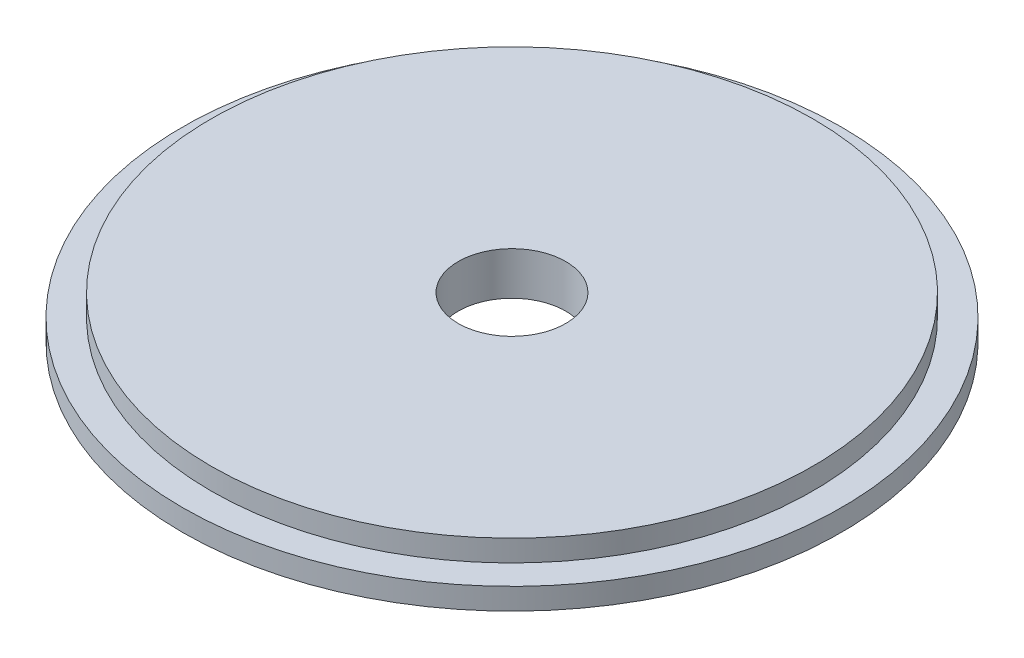
ISO-10303-21;
HEADER;
FILE_DESCRIPTION(('STEP AP214'),'2;1');
FILE_NAME('part.step','',(''),(''),'','','');
FILE_SCHEMA(('AUTOMOTIVE_DESIGN { 1 0 10303 214 1 1 1 1 }'));
ENDSEC;
DATA;
#1=APPLICATION_CONTEXT('core data for automotive mechanical design processes');
#2=APPLICATION_PROTOCOL_DEFINITION('international standard','automotive_design',2000,#1);
#3=PRODUCT_CONTEXT('',#1,'mechanical');
#4=PRODUCT('Part','Part','',(#3));
#5=PRODUCT_RELATED_PRODUCT_CATEGORY('part','',(#4));
#6=PRODUCT_DEFINITION_FORMATION('','',#4);
#7=PRODUCT_DEFINITION_CONTEXT('part definition',#1,'design');
#8=PRODUCT_DEFINITION('design','',#6,#7);
#9=PRODUCT_DEFINITION_SHAPE('','',#8);
#10=(LENGTH_UNIT() NAMED_UNIT(*) SI_UNIT(.MILLI.,.METRE.));
#11=(NAMED_UNIT(*) PLANE_ANGLE_UNIT() SI_UNIT($,.RADIAN.));
#12=(NAMED_UNIT(*) SI_UNIT($,.STERADIAN.) SOLID_ANGLE_UNIT());
#13=UNCERTAINTY_MEASURE_WITH_UNIT(LENGTH_MEASURE(1.E-05),#10,'distance_accuracy_value','');
#14=(GEOMETRIC_REPRESENTATION_CONTEXT(3) GLOBAL_UNCERTAINTY_ASSIGNED_CONTEXT((#13)) GLOBAL_UNIT_ASSIGNED_CONTEXT((#10,
#11,#12)) REPRESENTATION_CONTEXT('',''));
#15=CARTESIAN_POINT('',(0.,0.,0.));
#16=DIRECTION('',(0.,0.,1.));
#17=DIRECTION('',(1.,0.,0.));
#18=AXIS2_PLACEMENT_3D('',#15,#16,#17);
#19=CARTESIAN_POINT('',(0.,1.5,0.));
#20=DIRECTION('',(0.,-1.,0.));
#21=DIRECTION('',(0.,0.,-1.));
#22=AXIS2_PLACEMENT_3D('',#19,#20,#21);
#23=CYLINDRICAL_SURFACE('',#22,23.);
#24=CARTESIAN_POINT('',(0.,1.5,0.));
#25=DIRECTION('',(0.,1.,0.));
#26=DIRECTION('',(0.,0.,1.));
#27=AXIS2_PLACEMENT_3D('',#24,#25,#26);
#28=CIRCLE('',#27,23.);
#29=CARTESIAN_POINT('',(0.,1.5,23.));
#30=VERTEX_POINT('',#29);
#31=EDGE_CURVE('E10',#30,#30,#28,.T.);
#32=ORIENTED_EDGE('',*,*,#31,.F.);
#33=EDGE_LOOP('',(#32));
#34=FACE_BOUND('',#33,.T.);
#35=CARTESIAN_POINT('',(0.,0.,0.));
#36=DIRECTION('',(0.,1.,0.));
#37=DIRECTION('',(0.,0.,1.));
#38=AXIS2_PLACEMENT_3D('',#35,#36,#37);
#39=CIRCLE('',#38,23.);
#40=CARTESIAN_POINT('',(0.,0.,23.));
#41=VERTEX_POINT('',#40);
#42=EDGE_CURVE('E34',#41,#41,#39,.T.);
#43=ORIENTED_EDGE('',*,*,#42,.T.);
#44=EDGE_LOOP('',(#43));
#45=FACE_BOUND('',#44,.T.);
#46=ADVANCED_FACE('F31',(#34,#45),#23,.T.);
#47=CARTESIAN_POINT('',(0.,1.5,0.));
#48=DIRECTION('',(0.,1.,0.));
#49=DIRECTION('',(0.,0.,1.));
#50=AXIS2_PLACEMENT_3D('',#47,#48,#49);
#51=PLANE('',#50);
#52=CARTESIAN_POINT('',(0.,1.5,0.));
#53=DIRECTION('',(0.,1.,0.));
#54=DIRECTION('',(0.,0.,1.));
#55=AXIS2_PLACEMENT_3D('',#52,#53,#54);
#56=CIRCLE('',#55,21.);
#57=CARTESIAN_POINT('',(0.,1.5,21.));
#58=VERTEX_POINT('',#57);
#59=EDGE_CURVE('E43',#58,#58,#56,.T.);
#60=ORIENTED_EDGE('',*,*,#59,.F.);
#61=EDGE_LOOP('',(#60));
#62=FACE_BOUND('',#61,.T.);
#63=ORIENTED_EDGE('',*,*,#31,.T.);
#64=EDGE_LOOP('',(#63));
#65=FACE_BOUND('',#64,.T.);
#66=ADVANCED_FACE('F76',(#62,#65),#51,.T.);
#67=CARTESIAN_POINT('',(0.,0.,0.));
#68=DIRECTION('',(0.,1.,0.));
#69=DIRECTION('',(0.,0.,1.));
#70=AXIS2_PLACEMENT_3D('',#67,#68,#69);
#71=PLANE('',#70);
#72=CARTESIAN_POINT('',(0.,0.,0.));
#73=DIRECTION('',(0.,1.,0.));
#74=DIRECTION('',(0.,0.,1.));
#75=AXIS2_PLACEMENT_3D('',#72,#73,#74);
#76=CIRCLE('',#75,3.75);
#77=CARTESIAN_POINT('',(0.,0.,3.75));
#78=VERTEX_POINT('',#77);
#79=EDGE_CURVE('E46',#78,#78,#76,.T.);
#80=ORIENTED_EDGE('',*,*,#79,.T.);
#81=EDGE_LOOP('',(#80));
#82=FACE_BOUND('',#81,.T.);
#83=ORIENTED_EDGE('',*,*,#42,.F.);
#84=EDGE_LOOP('',(#83));
#85=FACE_BOUND('',#84,.T.);
#86=ADVANCED_FACE('F55',(#82,#85),#71,.F.);
#87=CARTESIAN_POINT('',(0.,3.,0.));
#88=DIRECTION('',(0.,-1.,0.));
#89=DIRECTION('',(0.,0.,-1.));
#90=AXIS2_PLACEMENT_3D('',#87,#88,#89);
#91=CYLINDRICAL_SURFACE('',#90,21.);
#92=CARTESIAN_POINT('',(0.,3.,0.));
#93=DIRECTION('',(0.,1.,0.));
#94=DIRECTION('',(0.,0.,1.));
#95=AXIS2_PLACEMENT_3D('',#92,#93,#94);
#96=CIRCLE('',#95,21.);
#97=CARTESIAN_POINT('',(0.,3.,21.));
#98=VERTEX_POINT('',#97);
#99=EDGE_CURVE('E41',#98,#98,#96,.T.);
#100=ORIENTED_EDGE('',*,*,#99,.F.);
#101=EDGE_LOOP('',(#100));
#102=FACE_BOUND('',#101,.T.);
#103=ORIENTED_EDGE('',*,*,#59,.T.);
#104=EDGE_LOOP('',(#103));
#105=FACE_BOUND('',#104,.T.);
#106=ADVANCED_FACE('F67',(#102,#105),#91,.T.);
#107=CARTESIAN_POINT('',(0.,3.,0.));
#108=DIRECTION('',(0.,1.,0.));
#109=DIRECTION('',(0.,0.,1.));
#110=AXIS2_PLACEMENT_3D('',#107,#108,#109);
#111=PLANE('',#110);
#112=CARTESIAN_POINT('',(0.,3.,0.));
#113=DIRECTION('',(0.,1.,0.));
#114=DIRECTION('',(0.,0.,1.));
#115=AXIS2_PLACEMENT_3D('',#112,#113,#114);
#116=CIRCLE('',#115,3.75);
#117=CARTESIAN_POINT('',(0.,3.,3.75));
#118=VERTEX_POINT('',#117);
#119=EDGE_CURVE('E49',#118,#118,#116,.T.);
#120=ORIENTED_EDGE('',*,*,#119,.F.);
#121=EDGE_LOOP('',(#120));
#122=FACE_BOUND('',#121,.T.);
#123=ORIENTED_EDGE('',*,*,#99,.T.);
#124=EDGE_LOOP('',(#123));
#125=FACE_BOUND('',#124,.T.);
#126=ADVANCED_FACE('F61',(#122,#125),#111,.T.);
#127=CARTESIAN_POINT('',(0.,0.,0.));
#128=DIRECTION('',(0.,1.,0.));
#129=DIRECTION('',(0.,0.,1.));
#130=AXIS2_PLACEMENT_3D('',#127,#128,#129);
#131=CYLINDRICAL_SURFACE('',#130,3.75);
#132=ORIENTED_EDGE('',*,*,#79,.F.);
#133=EDGE_LOOP('',(#132));
#134=FACE_BOUND('',#133,.T.);
#135=ORIENTED_EDGE('',*,*,#119,.T.);
#136=EDGE_LOOP('',(#135));
#137=FACE_BOUND('',#136,.T.);
#138=ADVANCED_FACE('F58',(#134,#137),#131,.F.);
#139=CLOSED_SHELL('',(#46,#66,#86,#106,#126,#138));
#140=MANIFOLD_SOLID_BREP('B2',#139);
#141=ADVANCED_BREP_SHAPE_REPRESENTATION('',(#18,#140),#14);
#142=SHAPE_DEFINITION_REPRESENTATION(#9,#141);
ENDSEC;
END-ISO-10303-21;
